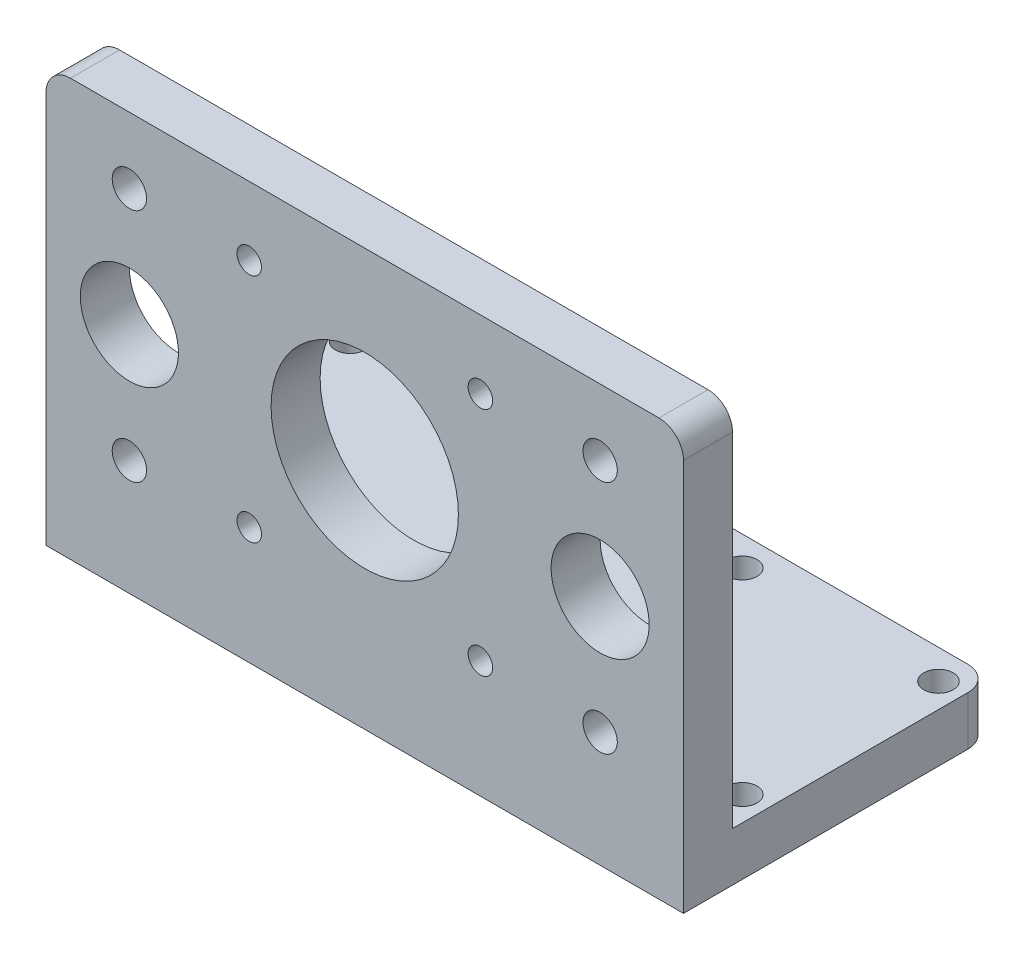
ISO-10303-21;
HEADER;
FILE_DESCRIPTION(('STEP AP214'),'2;1');
FILE_NAME('part.step','',(''),(''),'','','');
FILE_SCHEMA(('AUTOMOTIVE_DESIGN { 1 0 10303 214 1 1 1 1 }'));
ENDSEC;
DATA;
#1=APPLICATION_CONTEXT('core data for automotive mechanical design processes');
#2=APPLICATION_PROTOCOL_DEFINITION('international standard','automotive_design',2000,#1);
#3=PRODUCT_CONTEXT('',#1,'mechanical');
#4=PRODUCT('Part','Part','',(#3));
#5=PRODUCT_RELATED_PRODUCT_CATEGORY('part','',(#4));
#6=PRODUCT_DEFINITION_FORMATION('','',#4);
#7=PRODUCT_DEFINITION_CONTEXT('part definition',#1,'design');
#8=PRODUCT_DEFINITION('design','',#6,#7);
#9=PRODUCT_DEFINITION_SHAPE('','',#8);
#10=(LENGTH_UNIT() NAMED_UNIT(*) SI_UNIT(.MILLI.,.METRE.));
#11=(NAMED_UNIT(*) PLANE_ANGLE_UNIT() SI_UNIT($,.RADIAN.));
#12=(NAMED_UNIT(*) SI_UNIT($,.STERADIAN.) SOLID_ANGLE_UNIT());
#13=UNCERTAINTY_MEASURE_WITH_UNIT(LENGTH_MEASURE(1.E-05),#10,'distance_accuracy_value','');
#14=(GEOMETRIC_REPRESENTATION_CONTEXT(3) GLOBAL_UNCERTAINTY_ASSIGNED_CONTEXT((#13)) GLOBAL_UNIT_ASSIGNED_CONTEXT((#10,
#11,#12)) REPRESENTATION_CONTEXT('',''));
#15=CARTESIAN_POINT('',(0.,0.,0.));
#16=DIRECTION('',(0.,0.,1.));
#17=DIRECTION('',(1.,0.,0.));
#18=AXIS2_PLACEMENT_3D('',#15,#16,#17);
#19=CARTESIAN_POINT('',(0.,10.,0.));
#20=DIRECTION('',(-1.,0.,0.));
#21=DIRECTION('',(0.,0.,1.));
#22=AXIS2_PLACEMENT_3D('',#19,#20,#21);
#23=PLANE('',#22);
#24=DIRECTION('',(0.,-1.,0.));
#25=VECTOR('',#24,1.);
#26=CARTESIAN_POINT('',(0.,0.,0.));
#27=LINE('',#26,#25);
#28=CARTESIAN_POINT('',(0.,80.,0.));
#29=VERTEX_POINT('',#28);
#30=CARTESIAN_POINT('',(0.,0.,0.));
#31=VERTEX_POINT('',#30);
#32=EDGE_CURVE('E159',#29,#31,#27,.T.);
#33=ORIENTED_EDGE('',*,*,#32,.F.);
#34=DIRECTION('',(0.,0.,1.));
#35=VECTOR('',#34,1.);
#36=CARTESIAN_POINT('',(0.,80.,-10.));
#37=LINE('',#36,#35);
#38=CARTESIAN_POINT('',(0.,80.,-10.));
#39=VERTEX_POINT('',#38);
#40=EDGE_CURVE('E11',#29,#39,#37,.F.);
#41=ORIENTED_EDGE('',*,*,#40,.T.);
#42=DIRECTION('',(0.,-1.,0.));
#43=VECTOR('',#42,1.);
#44=CARTESIAN_POINT('',(0.,85.,-10.));
#45=LINE('',#44,#43);
#46=CARTESIAN_POINT('',(0.,10.,-10.));
#47=VERTEX_POINT('',#46);
#48=EDGE_CURVE('E115',#39,#47,#45,.T.);
#49=ORIENTED_EDGE('',*,*,#48,.T.);
#50=DIRECTION('',(0.,0.,-1.));
#51=VECTOR('',#50,1.);
#52=CARTESIAN_POINT('',(0.,10.,0.));
#53=LINE('',#52,#51);
#54=CARTESIAN_POINT('',(0.,10.,-58.));
#55=VERTEX_POINT('',#54);
#56=EDGE_CURVE('E118',#47,#55,#53,.T.);
#57=ORIENTED_EDGE('',*,*,#56,.T.);
#58=DIRECTION('',(0.,-1.,0.));
#59=VECTOR('',#58,1.);
#60=CARTESIAN_POINT('',(0.,10.,-58.));
#61=LINE('',#60,#59);
#62=CARTESIAN_POINT('',(0.,0.,-58.));
#63=VERTEX_POINT('',#62);
#64=EDGE_CURVE('E213',#55,#63,#61,.T.);
#65=ORIENTED_EDGE('',*,*,#64,.T.);
#66=DIRECTION('',(0.,0.,-1.));
#67=VECTOR('',#66,1.);
#68=CARTESIAN_POINT('',(0.,0.,0.));
#69=LINE('',#68,#67);
#70=EDGE_CURVE('E219',#31,#63,#69,.T.);
#71=ORIENTED_EDGE('',*,*,#70,.F.);
#72=EDGE_LOOP('',(#33,#41,#49,#57,#65,#71));
#73=FACE_BOUND('',#72,.T.);
#74=ADVANCED_FACE('F38',(#73),#23,.T.);
#75=CARTESIAN_POINT('',(130.,10.,0.));
#76=DIRECTION('',(-1.,0.,0.));
#77=DIRECTION('',(0.,0.,1.));
#78=AXIS2_PLACEMENT_3D('',#75,#76,#77);
#79=PLANE('',#78);
#80=DIRECTION('',(0.,-1.,0.));
#81=VECTOR('',#80,1.);
#82=CARTESIAN_POINT('',(130.,85.,-10.));
#83=LINE('',#82,#81);
#84=CARTESIAN_POINT('',(130.,80.,-10.));
#85=VERTEX_POINT('',#84);
#86=CARTESIAN_POINT('',(130.,10.,-10.));
#87=VERTEX_POINT('',#86);
#88=EDGE_CURVE('E124',#85,#87,#83,.T.);
#89=ORIENTED_EDGE('',*,*,#88,.F.);
#90=DIRECTION('',(0.,0.,-1.));
#91=VECTOR('',#90,1.);
#92=CARTESIAN_POINT('',(130.,80.,0.));
#93=LINE('',#92,#91);
#94=CARTESIAN_POINT('',(130.,80.,0.));
#95=VERTEX_POINT('',#94);
#96=EDGE_CURVE('E61',#85,#95,#93,.F.);
#97=ORIENTED_EDGE('',*,*,#96,.T.);
#98=DIRECTION('',(0.,1.,0.));
#99=VECTOR('',#98,1.);
#100=CARTESIAN_POINT('',(130.,0.,0.));
#101=LINE('',#100,#99);
#102=CARTESIAN_POINT('',(130.,0.,0.));
#103=VERTEX_POINT('',#102);
#104=EDGE_CURVE('E163',#103,#95,#101,.T.);
#105=ORIENTED_EDGE('',*,*,#104,.F.);
#106=DIRECTION('',(0.,0.,-1.));
#107=VECTOR('',#106,1.);
#108=CARTESIAN_POINT('',(130.,0.,0.));
#109=LINE('',#108,#107);
#110=CARTESIAN_POINT('',(130.,0.,-58.));
#111=VERTEX_POINT('',#110);
#112=EDGE_CURVE('E217',#103,#111,#109,.T.);
#113=ORIENTED_EDGE('',*,*,#112,.T.);
#114=DIRECTION('',(0.,-1.,0.));
#115=VECTOR('',#114,1.);
#116=CARTESIAN_POINT('',(130.,10.,-58.));
#117=LINE('',#116,#115);
#118=CARTESIAN_POINT('',(130.,10.,-58.));
#119=VERTEX_POINT('',#118);
#120=EDGE_CURVE('E210',#111,#119,#117,.F.);
#121=ORIENTED_EDGE('',*,*,#120,.T.);
#122=DIRECTION('',(0.,0.,-1.));
#123=VECTOR('',#122,1.);
#124=CARTESIAN_POINT('',(130.,10.,0.));
#125=LINE('',#124,#123);
#126=EDGE_CURVE('E137',#87,#119,#125,.T.);
#127=ORIENTED_EDGE('',*,*,#126,.F.);
#128=EDGE_LOOP('',(#89,#97,#105,#113,#121,#127));
#129=FACE_BOUND('',#128,.T.);
#130=ADVANCED_FACE('F264',(#129),#79,.F.);
#131=CARTESIAN_POINT('',(5.,10.,-57.));
#132=DIRECTION('',(0.,-1.,0.));
#133=DIRECTION('',(0.,0.,-1.));
#134=AXIS2_PLACEMENT_3D('',#131,#132,#133);
#135=CYLINDRICAL_SURFACE('',#134,3.);
#136=CARTESIAN_POINT('',(5.,10.,-57.));
#137=DIRECTION('',(0.,1.,0.));
#138=DIRECTION('',(0.,0.,1.));
#139=AXIS2_PLACEMENT_3D('',#136,#137,#138);
#140=CIRCLE('',#139,3.);
#141=CARTESIAN_POINT('',(5.,10.,-54.));
#142=VERTEX_POINT('',#141);
#143=EDGE_CURVE('E138',#142,#142,#140,.T.);
#144=ORIENTED_EDGE('',*,*,#143,.T.);
#145=EDGE_LOOP('',(#144));
#146=FACE_BOUND('',#145,.T.);
#147=CARTESIAN_POINT('',(5.,0.,-57.));
#148=DIRECTION('',(0.,1.,0.));
#149=DIRECTION('',(0.,0.,1.));
#150=AXIS2_PLACEMENT_3D('',#147,#148,#149);
#151=CIRCLE('',#150,3.);
#152=CARTESIAN_POINT('',(5.,0.,-54.));
#153=VERTEX_POINT('',#152);
#154=EDGE_CURVE('E221',#153,#153,#151,.T.);
#155=ORIENTED_EDGE('',*,*,#154,.F.);
#156=EDGE_LOOP('',(#155));
#157=FACE_BOUND('',#156,.T.);
#158=ADVANCED_FACE('F269',(#146,#157),#135,.F.);
#159=CARTESIAN_POINT('',(45.,10.,-57.));
#160=DIRECTION('',(0.,-1.,0.));
#161=DIRECTION('',(0.,0.,-1.));
#162=AXIS2_PLACEMENT_3D('',#159,#160,#161);
#163=CYLINDRICAL_SURFACE('',#162,3.);
#164=CARTESIAN_POINT('',(45.,10.,-57.));
#165=DIRECTION('',(0.,1.,0.));
#166=DIRECTION('',(0.,0.,1.));
#167=AXIS2_PLACEMENT_3D('',#164,#165,#166);
#168=CIRCLE('',#167,3.);
#169=CARTESIAN_POINT('',(45.,10.,-54.));
#170=VERTEX_POINT('',#169);
#171=EDGE_CURVE('E185',#170,#170,#168,.T.);
#172=ORIENTED_EDGE('',*,*,#171,.T.);
#173=EDGE_LOOP('',(#172));
#174=FACE_BOUND('',#173,.T.);
#175=CARTESIAN_POINT('',(45.,0.,-57.));
#176=DIRECTION('',(0.,1.,0.));
#177=DIRECTION('',(0.,0.,1.));
#178=AXIS2_PLACEMENT_3D('',#175,#176,#177);
#179=CIRCLE('',#178,3.);
#180=CARTESIAN_POINT('',(45.,0.,-54.));
#181=VERTEX_POINT('',#180);
#182=EDGE_CURVE('E224',#181,#181,#179,.T.);
#183=ORIENTED_EDGE('',*,*,#182,.F.);
#184=EDGE_LOOP('',(#183));
#185=FACE_BOUND('',#184,.T.);
#186=ADVANCED_FACE('F274',(#174,#185),#163,.F.);
#187=CARTESIAN_POINT('',(5.,10.,-17.));
#188=DIRECTION('',(0.,-1.,0.));
#189=DIRECTION('',(0.,0.,-1.));
#190=AXIS2_PLACEMENT_3D('',#187,#188,#189);
#191=CYLINDRICAL_SURFACE('',#190,3.);
#192=CARTESIAN_POINT('',(5.,10.,-17.));
#193=DIRECTION('',(0.,1.,0.));
#194=DIRECTION('',(0.,0.,1.));
#195=AXIS2_PLACEMENT_3D('',#192,#193,#194);
#196=CIRCLE('',#195,3.);
#197=CARTESIAN_POINT('',(5.,10.,-14.));
#198=VERTEX_POINT('',#197);
#199=EDGE_CURVE('E182',#198,#198,#196,.T.);
#200=ORIENTED_EDGE('',*,*,#199,.T.);
#201=EDGE_LOOP('',(#200));
#202=FACE_BOUND('',#201,.T.);
#203=CARTESIAN_POINT('',(5.,0.,-17.));
#204=DIRECTION('',(0.,1.,0.));
#205=DIRECTION('',(0.,0.,1.));
#206=AXIS2_PLACEMENT_3D('',#203,#204,#205);
#207=CIRCLE('',#206,3.);
#208=CARTESIAN_POINT('',(5.,0.,-14.));
#209=VERTEX_POINT('',#208);
#210=EDGE_CURVE('E227',#209,#209,#207,.T.);
#211=ORIENTED_EDGE('',*,*,#210,.F.);
#212=EDGE_LOOP('',(#211));
#213=FACE_BOUND('',#212,.T.);
#214=ADVANCED_FACE('F278',(#202,#213),#191,.F.);
#215=CARTESIAN_POINT('',(45.,10.,-17.));
#216=DIRECTION('',(0.,-1.,0.));
#217=DIRECTION('',(0.,0.,-1.));
#218=AXIS2_PLACEMENT_3D('',#215,#216,#217);
#219=CYLINDRICAL_SURFACE('',#218,3.);
#220=CARTESIAN_POINT('',(45.,10.,-17.));
#221=DIRECTION('',(0.,1.,0.));
#222=DIRECTION('',(0.,0.,1.));
#223=AXIS2_PLACEMENT_3D('',#220,#221,#222);
#224=CIRCLE('',#223,3.);
#225=CARTESIAN_POINT('',(45.,10.,-14.));
#226=VERTEX_POINT('',#225);
#227=EDGE_CURVE('E179',#226,#226,#224,.T.);
#228=ORIENTED_EDGE('',*,*,#227,.T.);
#229=EDGE_LOOP('',(#228));
#230=FACE_BOUND('',#229,.T.);
#231=CARTESIAN_POINT('',(45.,0.,-17.));
#232=DIRECTION('',(0.,1.,0.));
#233=DIRECTION('',(0.,0.,1.));
#234=AXIS2_PLACEMENT_3D('',#231,#232,#233);
#235=CIRCLE('',#234,3.);
#236=CARTESIAN_POINT('',(45.,0.,-14.));
#237=VERTEX_POINT('',#236);
#238=EDGE_CURVE('E230',#237,#237,#235,.T.);
#239=ORIENTED_EDGE('',*,*,#238,.F.);
#240=EDGE_LOOP('',(#239));
#241=FACE_BOUND('',#240,.T.);
#242=ADVANCED_FACE('F282',(#230,#241),#219,.F.);
#243=CARTESIAN_POINT('',(85.,10.,-57.));
#244=DIRECTION('',(0.,-1.,0.));
#245=DIRECTION('',(0.,0.,-1.));
#246=AXIS2_PLACEMENT_3D('',#243,#244,#245);
#247=CYLINDRICAL_SURFACE('',#246,3.00000000000001);
#248=CARTESIAN_POINT('',(85.,10.,-57.));
#249=DIRECTION('',(0.,1.,0.));
#250=DIRECTION('',(0.,0.,1.));
#251=AXIS2_PLACEMENT_3D('',#248,#249,#250);
#252=CIRCLE('',#251,3.00000000000001);
#253=CARTESIAN_POINT('',(85.,10.,-54.));
#254=VERTEX_POINT('',#253);
#255=EDGE_CURVE('E176',#254,#254,#252,.T.);
#256=ORIENTED_EDGE('',*,*,#255,.T.);
#257=EDGE_LOOP('',(#256));
#258=FACE_BOUND('',#257,.T.);
#259=CARTESIAN_POINT('',(85.,0.,-57.));
#260=DIRECTION('',(0.,1.,0.));
#261=DIRECTION('',(0.,0.,1.));
#262=AXIS2_PLACEMENT_3D('',#259,#260,#261);
#263=CIRCLE('',#262,3.00000000000001);
#264=CARTESIAN_POINT('',(85.,0.,-54.));
#265=VERTEX_POINT('',#264);
#266=EDGE_CURVE('E233',#265,#265,#263,.T.);
#267=ORIENTED_EDGE('',*,*,#266,.F.);
#268=EDGE_LOOP('',(#267));
#269=FACE_BOUND('',#268,.T.);
#270=ADVANCED_FACE('F286',(#258,#269),#247,.F.);
#271=CARTESIAN_POINT('',(125.,10.,-57.));
#272=DIRECTION('',(0.,-1.,0.));
#273=DIRECTION('',(0.,0.,-1.));
#274=AXIS2_PLACEMENT_3D('',#271,#272,#273);
#275=CYLINDRICAL_SURFACE('',#274,2.99999999999999);
#276=CARTESIAN_POINT('',(125.,10.,-57.));
#277=DIRECTION('',(0.,1.,0.));
#278=DIRECTION('',(0.,0.,1.));
#279=AXIS2_PLACEMENT_3D('',#276,#277,#278);
#280=CIRCLE('',#279,2.99999999999999);
#281=CARTESIAN_POINT('',(125.,10.,-54.));
#282=VERTEX_POINT('',#281);
#283=EDGE_CURVE('E173',#282,#282,#280,.T.);
#284=ORIENTED_EDGE('',*,*,#283,.T.);
#285=EDGE_LOOP('',(#284));
#286=FACE_BOUND('',#285,.T.);
#287=CARTESIAN_POINT('',(125.,0.,-57.));
#288=DIRECTION('',(0.,1.,0.));
#289=DIRECTION('',(0.,0.,1.));
#290=AXIS2_PLACEMENT_3D('',#287,#288,#289);
#291=CIRCLE('',#290,2.99999999999999);
#292=CARTESIAN_POINT('',(125.,0.,-54.));
#293=VERTEX_POINT('',#292);
#294=EDGE_CURVE('E236',#293,#293,#291,.T.);
#295=ORIENTED_EDGE('',*,*,#294,.F.);
#296=EDGE_LOOP('',(#295));
#297=FACE_BOUND('',#296,.T.);
#298=ADVANCED_FACE('F259',(#286,#297),#275,.F.);
#299=CARTESIAN_POINT('',(85.,10.,-17.));
#300=DIRECTION('',(0.,-1.,0.));
#301=DIRECTION('',(0.,0.,-1.));
#302=AXIS2_PLACEMENT_3D('',#299,#300,#301);
#303=CYLINDRICAL_SURFACE('',#302,3.00000000000001);
#304=CARTESIAN_POINT('',(85.,10.,-17.));
#305=DIRECTION('',(0.,1.,0.));
#306=DIRECTION('',(0.,0.,1.));
#307=AXIS2_PLACEMENT_3D('',#304,#305,#306);
#308=CIRCLE('',#307,3.00000000000001);
#309=CARTESIAN_POINT('',(85.,10.,-14.));
#310=VERTEX_POINT('',#309);
#311=EDGE_CURVE('E169',#310,#310,#308,.T.);
#312=ORIENTED_EDGE('',*,*,#311,.T.);
#313=EDGE_LOOP('',(#312));
#314=FACE_BOUND('',#313,.T.);
#315=CARTESIAN_POINT('',(85.,0.,-17.));
#316=DIRECTION('',(0.,1.,0.));
#317=DIRECTION('',(0.,0.,1.));
#318=AXIS2_PLACEMENT_3D('',#315,#316,#317);
#319=CIRCLE('',#318,3.00000000000001);
#320=CARTESIAN_POINT('',(85.,0.,-14.));
#321=VERTEX_POINT('',#320);
#322=EDGE_CURVE('E239',#321,#321,#319,.T.);
#323=ORIENTED_EDGE('',*,*,#322,.F.);
#324=EDGE_LOOP('',(#323));
#325=FACE_BOUND('',#324,.T.);
#326=ADVANCED_FACE('F250',(#314,#325),#303,.F.);
#327=CARTESIAN_POINT('',(125.,10.,-17.));
#328=DIRECTION('',(0.,-1.,0.));
#329=DIRECTION('',(0.,0.,-1.));
#330=AXIS2_PLACEMENT_3D('',#327,#328,#329);
#331=CYLINDRICAL_SURFACE('',#330,2.99999999999999);
#332=CARTESIAN_POINT('',(125.,10.,-17.));
#333=DIRECTION('',(0.,1.,0.));
#334=DIRECTION('',(0.,0.,1.));
#335=AXIS2_PLACEMENT_3D('',#332,#333,#334);
#336=CIRCLE('',#335,2.99999999999999);
#337=CARTESIAN_POINT('',(125.,10.,-14.));
#338=VERTEX_POINT('',#337);
#339=EDGE_CURVE('E166',#338,#338,#336,.T.);
#340=ORIENTED_EDGE('',*,*,#339,.T.);
#341=EDGE_LOOP('',(#340));
#342=FACE_BOUND('',#341,.T.);
#343=CARTESIAN_POINT('',(125.,0.,-17.));
#344=DIRECTION('',(0.,1.,0.));
#345=DIRECTION('',(0.,0.,1.));
#346=AXIS2_PLACEMENT_3D('',#343,#344,#345);
#347=CIRCLE('',#346,2.99999999999999);
#348=CARTESIAN_POINT('',(125.,0.,-14.));
#349=VERTEX_POINT('',#348);
#350=EDGE_CURVE('E165',#349,#349,#347,.T.);
#351=ORIENTED_EDGE('',*,*,#350,.F.);
#352=EDGE_LOOP('',(#351));
#353=FACE_BOUND('',#352,.T.);
#354=ADVANCED_FACE('F247',(#342,#353),#331,.F.);
#355=CARTESIAN_POINT('',(0.,10.,-63.));
#356=DIRECTION('',(0.,0.,-1.));
#357=DIRECTION('',(-1.,0.,0.));
#358=AXIS2_PLACEMENT_3D('',#355,#356,#357);
#359=PLANE('',#358);
#360=DIRECTION('',(1.,0.,0.));
#361=VECTOR('',#360,1.);
#362=CARTESIAN_POINT('',(0.,10.,-63.));
#363=LINE('',#362,#361);
#364=CARTESIAN_POINT('',(5.,10.,-63.));
#365=VERTEX_POINT('',#364);
#366=CARTESIAN_POINT('',(125.,10.,-63.));
#367=VERTEX_POINT('',#366);
#368=EDGE_CURVE('E193',#365,#367,#363,.T.);
#369=ORIENTED_EDGE('',*,*,#368,.T.);
#370=DIRECTION('',(0.,-1.,0.));
#371=VECTOR('',#370,1.);
#372=CARTESIAN_POINT('',(125.,0.,-63.));
#373=LINE('',#372,#371);
#374=CARTESIAN_POINT('',(125.,0.,-63.));
#375=VERTEX_POINT('',#374);
#376=EDGE_CURVE('E205',#367,#375,#373,.T.);
#377=ORIENTED_EDGE('',*,*,#376,.T.);
#378=DIRECTION('',(1.,0.,0.));
#379=VECTOR('',#378,1.);
#380=CARTESIAN_POINT('',(0.,0.,-63.));
#381=LINE('',#380,#379);
#382=CARTESIAN_POINT('',(5.,0.,-63.));
#383=VERTEX_POINT('',#382);
#384=EDGE_CURVE('E170',#383,#375,#381,.T.);
#385=ORIENTED_EDGE('',*,*,#384,.F.);
#386=DIRECTION('',(0.,-1.,0.));
#387=VECTOR('',#386,1.);
#388=CARTESIAN_POINT('',(5.,10.,-63.));
#389=LINE('',#388,#387);
#390=EDGE_CURVE('E208',#383,#365,#389,.F.);
#391=ORIENTED_EDGE('',*,*,#390,.T.);
#392=EDGE_LOOP('',(#369,#377,#385,#391));
#393=FACE_BOUND('',#392,.T.);
#394=ADVANCED_FACE('F249',(#393),#359,.T.);
#395=CARTESIAN_POINT('',(0.,10.,0.));
#396=DIRECTION('',(0.,1.,0.));
#397=DIRECTION('',(0.,0.,1.));
#398=AXIS2_PLACEMENT_3D('',#395,#396,#397);
#399=PLANE('',#398);
#400=DIRECTION('',(-1.,0.,0.));
#401=VECTOR('',#400,1.);
#402=CARTESIAN_POINT('',(0.,10.,-10.));
#403=LINE('',#402,#401);
#404=EDGE_CURVE('E131',#87,#47,#403,.T.);
#405=ORIENTED_EDGE('',*,*,#404,.F.);
#406=ORIENTED_EDGE('',*,*,#126,.T.);
#407=CARTESIAN_POINT('',(125.,10.,-58.));
#408=DIRECTION('',(0.,1.,0.));
#409=DIRECTION('',(0.,0.,1.));
#410=AXIS2_PLACEMENT_3D('',#407,#408,#409);
#411=CIRCLE('',#410,5.);
#412=EDGE_CURVE('E196',#119,#367,#411,.T.);
#413=ORIENTED_EDGE('',*,*,#412,.T.);
#414=ORIENTED_EDGE('',*,*,#368,.F.);
#415=CARTESIAN_POINT('',(5.,10.,-58.));
#416=DIRECTION('',(0.,1.,0.));
#417=DIRECTION('',(0.,0.,1.));
#418=AXIS2_PLACEMENT_3D('',#415,#416,#417);
#419=CIRCLE('',#418,5.);
#420=EDGE_CURVE('E135',#365,#55,#419,.T.);
#421=ORIENTED_EDGE('',*,*,#420,.T.);
#422=ORIENTED_EDGE('',*,*,#56,.F.);
#423=EDGE_LOOP('',(#405,#406,#413,#414,#421,#422));
#424=FACE_BOUND('',#423,.T.);
#425=ORIENTED_EDGE('',*,*,#339,.F.);
#426=EDGE_LOOP('',(#425));
#427=FACE_BOUND('',#426,.T.);
#428=ORIENTED_EDGE('',*,*,#311,.F.);
#429=EDGE_LOOP('',(#428));
#430=FACE_BOUND('',#429,.T.);
#431=ORIENTED_EDGE('',*,*,#283,.F.);
#432=EDGE_LOOP('',(#431));
#433=FACE_BOUND('',#432,.T.);
#434=ORIENTED_EDGE('',*,*,#255,.F.);
#435=EDGE_LOOP('',(#434));
#436=FACE_BOUND('',#435,.T.);
#437=ORIENTED_EDGE('',*,*,#227,.F.);
#438=EDGE_LOOP('',(#437));
#439=FACE_BOUND('',#438,.T.);
#440=ORIENTED_EDGE('',*,*,#199,.F.);
#441=EDGE_LOOP('',(#440));
#442=FACE_BOUND('',#441,.T.);
#443=ORIENTED_EDGE('',*,*,#171,.F.);
#444=EDGE_LOOP('',(#443));
#445=FACE_BOUND('',#444,.T.);
#446=ORIENTED_EDGE('',*,*,#143,.F.);
#447=EDGE_LOOP('',(#446));
#448=FACE_BOUND('',#447,.T.);
#449=ADVANCED_FACE('F129',(#424,#427,#430,#433,#436,#439,#442,#445,#448),#399,.T.);
#450=CARTESIAN_POINT('',(0.,0.,0.));
#451=DIRECTION('',(0.,1.,0.));
#452=DIRECTION('',(0.,0.,1.));
#453=AXIS2_PLACEMENT_3D('',#450,#451,#452);
#454=PLANE('',#453);
#455=ORIENTED_EDGE('',*,*,#350,.T.);
#456=EDGE_LOOP('',(#455));
#457=FACE_BOUND('',#456,.T.);
#458=ORIENTED_EDGE('',*,*,#322,.T.);
#459=EDGE_LOOP('',(#458));
#460=FACE_BOUND('',#459,.T.);
#461=ORIENTED_EDGE('',*,*,#294,.T.);
#462=EDGE_LOOP('',(#461));
#463=FACE_BOUND('',#462,.T.);
#464=ORIENTED_EDGE('',*,*,#266,.T.);
#465=EDGE_LOOP('',(#464));
#466=FACE_BOUND('',#465,.T.);
#467=ORIENTED_EDGE('',*,*,#238,.T.);
#468=EDGE_LOOP('',(#467));
#469=FACE_BOUND('',#468,.T.);
#470=ORIENTED_EDGE('',*,*,#210,.T.);
#471=EDGE_LOOP('',(#470));
#472=FACE_BOUND('',#471,.T.);
#473=ORIENTED_EDGE('',*,*,#182,.T.);
#474=EDGE_LOOP('',(#473));
#475=FACE_BOUND('',#474,.T.);
#476=ORIENTED_EDGE('',*,*,#154,.T.);
#477=EDGE_LOOP('',(#476));
#478=FACE_BOUND('',#477,.T.);
#479=ORIENTED_EDGE('',*,*,#112,.F.);
#480=DIRECTION('',(1.,0.,0.));
#481=VECTOR('',#480,1.);
#482=CARTESIAN_POINT('',(0.,0.,0.));
#483=LINE('',#482,#481);
#484=EDGE_CURVE('E161',#31,#103,#483,.T.);
#485=ORIENTED_EDGE('',*,*,#484,.F.);
#486=ORIENTED_EDGE('',*,*,#70,.T.);
#487=CARTESIAN_POINT('',(5.,0.,-58.));
#488=DIRECTION('',(0.,1.,0.));
#489=DIRECTION('',(0.,0.,1.));
#490=AXIS2_PLACEMENT_3D('',#487,#488,#489);
#491=CIRCLE('',#490,5.);
#492=EDGE_CURVE('E203',#63,#383,#491,.F.);
#493=ORIENTED_EDGE('',*,*,#492,.T.);
#494=ORIENTED_EDGE('',*,*,#384,.T.);
#495=CARTESIAN_POINT('',(125.,0.,-58.));
#496=DIRECTION('',(0.,1.,0.));
#497=DIRECTION('',(0.,0.,1.));
#498=AXIS2_PLACEMENT_3D('',#495,#496,#497);
#499=CIRCLE('',#498,5.);
#500=EDGE_CURVE('E200',#375,#111,#499,.F.);
#501=ORIENTED_EDGE('',*,*,#500,.T.);
#502=EDGE_LOOP('',(#479,#485,#486,#493,#494,#501));
#503=FACE_BOUND('',#502,.T.);
#504=ADVANCED_FACE('F244',(#457,#460,#463,#466,#469,#472,#475,#478,#503),#454,.F.);
#505=CARTESIAN_POINT('',(125.,10.,-58.));
#506=DIRECTION('',(0.,1.,0.));
#507=DIRECTION('',(0.,0.,1.));
#508=AXIS2_PLACEMENT_3D('',#505,#506,#507);
#509=CYLINDRICAL_SURFACE('',#508,5.);
#510=ORIENTED_EDGE('',*,*,#412,.F.);
#511=ORIENTED_EDGE('',*,*,#120,.F.);
#512=ORIENTED_EDGE('',*,*,#500,.F.);
#513=ORIENTED_EDGE('',*,*,#376,.F.);
#514=EDGE_LOOP('',(#510,#511,#512,#513));
#515=FACE_BOUND('',#514,.T.);
#516=ADVANCED_FACE('F301',(#515),#509,.T.);
#517=CARTESIAN_POINT('',(5.,10.,-58.));
#518=DIRECTION('',(0.,-1.,0.));
#519=DIRECTION('',(0.,0.,-1.));
#520=AXIS2_PLACEMENT_3D('',#517,#518,#519);
#521=CYLINDRICAL_SURFACE('',#520,5.);
#522=ORIENTED_EDGE('',*,*,#420,.F.);
#523=ORIENTED_EDGE('',*,*,#390,.F.);
#524=ORIENTED_EDGE('',*,*,#492,.F.);
#525=ORIENTED_EDGE('',*,*,#64,.F.);
#526=EDGE_LOOP('',(#522,#523,#524,#525));
#527=FACE_BOUND('',#526,.T.);
#528=ADVANCED_FACE('F355',(#527),#521,.T.);
#529=CARTESIAN_POINT('',(0.,0.,0.));
#530=DIRECTION('',(0.,0.,-1.));
#531=DIRECTION('',(-1.,0.,0.));
#532=AXIS2_PLACEMENT_3D('',#529,#530,#531);
#533=PLANE('',#532);
#534=CARTESIAN_POINT('',(65.,47.5,0.));
#535=DIRECTION('',(0.,0.,-1.));
#536=DIRECTION('',(-1.,0.,0.));
#537=AXIS2_PLACEMENT_3D('',#534,#535,#536);
#538=CIRCLE('',#537,19.1);
#539=CARTESIAN_POINT('',(45.9,47.5,0.));
#540=VERTEX_POINT('',#539);
#541=EDGE_CURVE('E645',#540,#540,#538,.T.);
#542=ORIENTED_EDGE('',*,*,#541,.T.);
#543=EDGE_LOOP('',(#542));
#544=FACE_BOUND('',#543,.T.);
#545=CARTESIAN_POINT('',(88.58,23.92,0.));
#546=DIRECTION('',(0.,0.,-1.));
#547=DIRECTION('',(-1.,0.,0.));
#548=AXIS2_PLACEMENT_3D('',#545,#546,#547);
#549=CIRCLE('',#548,2.5);
#550=CARTESIAN_POINT('',(86.08,23.92,0.));
#551=VERTEX_POINT('',#550);
#552=EDGE_CURVE('E653',#551,#551,#549,.T.);
#553=ORIENTED_EDGE('',*,*,#552,.T.);
#554=EDGE_LOOP('',(#553));
#555=FACE_BOUND('',#554,.T.);
#556=CARTESIAN_POINT('',(41.44,23.92,0.));
#557=DIRECTION('',(0.,0.,-1.));
#558=DIRECTION('',(-1.,0.,0.));
#559=AXIS2_PLACEMENT_3D('',#556,#557,#558);
#560=CIRCLE('',#559,2.5);
#561=CARTESIAN_POINT('',(38.94,23.92,0.));
#562=VERTEX_POINT('',#561);
#563=EDGE_CURVE('E659',#562,#562,#560,.T.);
#564=ORIENTED_EDGE('',*,*,#563,.T.);
#565=EDGE_LOOP('',(#564));
#566=FACE_BOUND('',#565,.T.);
#567=CARTESIAN_POINT('',(41.44,71.06,0.));
#568=DIRECTION('',(0.,0.,-1.));
#569=DIRECTION('',(-1.,0.,0.));
#570=AXIS2_PLACEMENT_3D('',#567,#568,#569);
#571=CIRCLE('',#570,2.5);
#572=CARTESIAN_POINT('',(38.94,71.06,0.));
#573=VERTEX_POINT('',#572);
#574=EDGE_CURVE('E665',#573,#573,#571,.T.);
#575=ORIENTED_EDGE('',*,*,#574,.T.);
#576=EDGE_LOOP('',(#575));
#577=FACE_BOUND('',#576,.T.);
#578=CARTESIAN_POINT('',(88.58,71.06,0.));
#579=DIRECTION('',(0.,0.,-1.));
#580=DIRECTION('',(-1.,0.,0.));
#581=AXIS2_PLACEMENT_3D('',#578,#579,#580);
#582=CIRCLE('',#581,2.5);
#583=CARTESIAN_POINT('',(86.08,71.06,0.));
#584=VERTEX_POINT('',#583);
#585=EDGE_CURVE('E671',#584,#584,#582,.T.);
#586=ORIENTED_EDGE('',*,*,#585,.T.);
#587=EDGE_LOOP('',(#586));
#588=FACE_BOUND('',#587,.T.);
#589=CARTESIAN_POINT('',(113.,23.5,0.));
#590=DIRECTION('',(0.,0.,-1.));
#591=DIRECTION('',(-1.,0.,0.));
#592=AXIS2_PLACEMENT_3D('',#589,#590,#591);
#593=CIRCLE('',#592,3.50000000000001);
#594=CARTESIAN_POINT('',(109.5,23.5,0.));
#595=VERTEX_POINT('',#594);
#596=EDGE_CURVE('E677',#595,#595,#593,.T.);
#597=ORIENTED_EDGE('',*,*,#596,.T.);
#598=EDGE_LOOP('',(#597));
#599=FACE_BOUND('',#598,.T.);
#600=CARTESIAN_POINT('',(17.,23.5,0.));
#601=DIRECTION('',(0.,0.,-1.));
#602=DIRECTION('',(-1.,0.,0.));
#603=AXIS2_PLACEMENT_3D('',#600,#601,#602);
#604=CIRCLE('',#603,3.5);
#605=CARTESIAN_POINT('',(13.5,23.5,0.));
#606=VERTEX_POINT('',#605);
#607=EDGE_CURVE('E683',#606,#606,#604,.T.);
#608=ORIENTED_EDGE('',*,*,#607,.T.);
#609=EDGE_LOOP('',(#608));
#610=FACE_BOUND('',#609,.T.);
#611=CARTESIAN_POINT('',(17.,71.5,0.));
#612=DIRECTION('',(0.,0.,-1.));
#613=DIRECTION('',(-1.,0.,0.));
#614=AXIS2_PLACEMENT_3D('',#611,#612,#613);
#615=CIRCLE('',#614,3.5);
#616=CARTESIAN_POINT('',(13.5,71.5,0.));
#617=VERTEX_POINT('',#616);
#618=EDGE_CURVE('E689',#617,#617,#615,.T.);
#619=ORIENTED_EDGE('',*,*,#618,.T.);
#620=EDGE_LOOP('',(#619));
#621=FACE_BOUND('',#620,.T.);
#622=CARTESIAN_POINT('',(113.,71.5,0.));
#623=DIRECTION('',(0.,0.,-1.));
#624=DIRECTION('',(-1.,0.,0.));
#625=AXIS2_PLACEMENT_3D('',#622,#623,#624);
#626=CIRCLE('',#625,3.50000000000001);
#627=CARTESIAN_POINT('',(109.5,71.5,0.));
#628=VERTEX_POINT('',#627);
#629=EDGE_CURVE('E695',#628,#628,#626,.T.);
#630=ORIENTED_EDGE('',*,*,#629,.T.);
#631=EDGE_LOOP('',(#630));
#632=FACE_BOUND('',#631,.T.);
#633=CARTESIAN_POINT('',(17.,47.5,0.));
#634=DIRECTION('',(0.,0.,-1.));
#635=DIRECTION('',(-1.,0.,0.));
#636=AXIS2_PLACEMENT_3D('',#633,#634,#635);
#637=CIRCLE('',#636,10.);
#638=CARTESIAN_POINT('',(7.,47.5,0.));
#639=VERTEX_POINT('',#638);
#640=EDGE_CURVE('E701',#639,#639,#637,.T.);
#641=ORIENTED_EDGE('',*,*,#640,.T.);
#642=EDGE_LOOP('',(#641));
#643=FACE_BOUND('',#642,.T.);
#644=CARTESIAN_POINT('',(113.,47.5,0.));
#645=DIRECTION('',(0.,0.,-1.));
#646=DIRECTION('',(-1.,0.,0.));
#647=AXIS2_PLACEMENT_3D('',#644,#645,#646);
#648=CIRCLE('',#647,9.99999999999999);
#649=CARTESIAN_POINT('',(103.,47.5,0.));
#650=VERTEX_POINT('',#649);
#651=EDGE_CURVE('E143',#650,#650,#648,.T.);
#652=ORIENTED_EDGE('',*,*,#651,.T.);
#653=EDGE_LOOP('',(#652));
#654=FACE_BOUND('',#653,.T.);
#655=ORIENTED_EDGE('',*,*,#104,.T.);
#656=CARTESIAN_POINT('',(125.,80.,0.));
#657=DIRECTION('',(0.,0.,-1.));
#658=DIRECTION('',(-1.,0.,0.));
#659=AXIS2_PLACEMENT_3D('',#656,#657,#658);
#660=CIRCLE('',#659,5.);
#661=CARTESIAN_POINT('',(125.,85.,0.));
#662=VERTEX_POINT('',#661);
#663=EDGE_CURVE('E46',#95,#662,#660,.F.);
#664=ORIENTED_EDGE('',*,*,#663,.T.);
#665=DIRECTION('',(1.,0.,0.));
#666=VECTOR('',#665,1.);
#667=CARTESIAN_POINT('',(0.,85.,0.));
#668=LINE('',#667,#666);
#669=CARTESIAN_POINT('',(5.,85.,0.));
#670=VERTEX_POINT('',#669);
#671=EDGE_CURVE('E142',#670,#662,#668,.T.);
#672=ORIENTED_EDGE('',*,*,#671,.F.);
#673=CARTESIAN_POINT('',(5.,80.,0.));
#674=DIRECTION('',(0.,0.,-1.));
#675=DIRECTION('',(-1.,0.,0.));
#676=AXIS2_PLACEMENT_3D('',#673,#674,#675);
#677=CIRCLE('',#676,5.);
#678=EDGE_CURVE('E53',#670,#29,#677,.F.);
#679=ORIENTED_EDGE('',*,*,#678,.T.);
#680=ORIENTED_EDGE('',*,*,#32,.T.);
#681=ORIENTED_EDGE('',*,*,#484,.T.);
#682=EDGE_LOOP('',(#655,#664,#672,#679,#680,#681));
#683=FACE_BOUND('',#682,.T.);
#684=ADVANCED_FACE('F319',(#544,#555,#566,#577,#588,#599,#610,#621,#632,#643,#654,#683),#533,.F.);
#685=CARTESIAN_POINT('',(0.,85.,-10.));
#686=DIRECTION('',(0.,0.,1.));
#687=DIRECTION('',(1.,0.,0.));
#688=AXIS2_PLACEMENT_3D('',#685,#686,#687);
#689=PLANE('',#688);
#690=CARTESIAN_POINT('',(65.,47.5,-10.));
#691=DIRECTION('',(0.,0.,-1.));
#692=DIRECTION('',(-1.,0.,0.));
#693=AXIS2_PLACEMENT_3D('',#690,#691,#692);
#694=CIRCLE('',#693,19.1);
#695=CARTESIAN_POINT('',(45.9,47.5,-10.));
#696=VERTEX_POINT('',#695);
#697=EDGE_CURVE('E648',#696,#696,#694,.T.);
#698=ORIENTED_EDGE('',*,*,#697,.F.);
#699=EDGE_LOOP('',(#698));
#700=FACE_BOUND('',#699,.T.);
#701=CARTESIAN_POINT('',(88.58,23.92,-10.));
#702=DIRECTION('',(0.,0.,-1.));
#703=DIRECTION('',(-1.,0.,0.));
#704=AXIS2_PLACEMENT_3D('',#701,#702,#703);
#705=CIRCLE('',#704,2.5);
#706=CARTESIAN_POINT('',(86.08,23.92,-10.));
#707=VERTEX_POINT('',#706);
#708=EDGE_CURVE('E650',#707,#707,#705,.T.);
#709=ORIENTED_EDGE('',*,*,#708,.F.);
#710=EDGE_LOOP('',(#709));
#711=FACE_BOUND('',#710,.T.);
#712=CARTESIAN_POINT('',(41.44,23.92,-10.));
#713=DIRECTION('',(0.,0.,-1.));
#714=DIRECTION('',(-1.,0.,0.));
#715=AXIS2_PLACEMENT_3D('',#712,#713,#714);
#716=CIRCLE('',#715,2.5);
#717=CARTESIAN_POINT('',(38.94,23.92,-10.));
#718=VERTEX_POINT('',#717);
#719=EDGE_CURVE('E656',#718,#718,#716,.T.);
#720=ORIENTED_EDGE('',*,*,#719,.F.);
#721=EDGE_LOOP('',(#720));
#722=FACE_BOUND('',#721,.T.);
#723=CARTESIAN_POINT('',(41.44,71.06,-10.));
#724=DIRECTION('',(0.,0.,-1.));
#725=DIRECTION('',(-1.,0.,0.));
#726=AXIS2_PLACEMENT_3D('',#723,#724,#725);
#727=CIRCLE('',#726,2.5);
#728=CARTESIAN_POINT('',(38.94,71.06,-10.));
#729=VERTEX_POINT('',#728);
#730=EDGE_CURVE('E662',#729,#729,#727,.T.);
#731=ORIENTED_EDGE('',*,*,#730,.F.);
#732=EDGE_LOOP('',(#731));
#733=FACE_BOUND('',#732,.T.);
#734=CARTESIAN_POINT('',(88.58,71.06,-10.));
#735=DIRECTION('',(0.,0.,-1.));
#736=DIRECTION('',(-1.,0.,0.));
#737=AXIS2_PLACEMENT_3D('',#734,#735,#736);
#738=CIRCLE('',#737,2.5);
#739=CARTESIAN_POINT('',(86.08,71.06,-10.));
#740=VERTEX_POINT('',#739);
#741=EDGE_CURVE('E668',#740,#740,#738,.T.);
#742=ORIENTED_EDGE('',*,*,#741,.F.);
#743=EDGE_LOOP('',(#742));
#744=FACE_BOUND('',#743,.T.);
#745=CARTESIAN_POINT('',(113.,23.5,-10.));
#746=DIRECTION('',(0.,0.,-1.));
#747=DIRECTION('',(-1.,0.,0.));
#748=AXIS2_PLACEMENT_3D('',#745,#746,#747);
#749=CIRCLE('',#748,3.50000000000001);
#750=CARTESIAN_POINT('',(109.5,23.5,-10.));
#751=VERTEX_POINT('',#750);
#752=EDGE_CURVE('E674',#751,#751,#749,.T.);
#753=ORIENTED_EDGE('',*,*,#752,.F.);
#754=EDGE_LOOP('',(#753));
#755=FACE_BOUND('',#754,.T.);
#756=CARTESIAN_POINT('',(17.,23.5,-10.));
#757=DIRECTION('',(0.,0.,-1.));
#758=DIRECTION('',(-1.,0.,0.));
#759=AXIS2_PLACEMENT_3D('',#756,#757,#758);
#760=CIRCLE('',#759,3.5);
#761=CARTESIAN_POINT('',(13.5,23.5,-10.));
#762=VERTEX_POINT('',#761);
#763=EDGE_CURVE('E680',#762,#762,#760,.T.);
#764=ORIENTED_EDGE('',*,*,#763,.F.);
#765=EDGE_LOOP('',(#764));
#766=FACE_BOUND('',#765,.T.);
#767=CARTESIAN_POINT('',(17.,71.5,-10.));
#768=DIRECTION('',(0.,0.,-1.));
#769=DIRECTION('',(-1.,0.,0.));
#770=AXIS2_PLACEMENT_3D('',#767,#768,#769);
#771=CIRCLE('',#770,3.5);
#772=CARTESIAN_POINT('',(13.5,71.5,-10.));
#773=VERTEX_POINT('',#772);
#774=EDGE_CURVE('E686',#773,#773,#771,.T.);
#775=ORIENTED_EDGE('',*,*,#774,.F.);
#776=EDGE_LOOP('',(#775));
#777=FACE_BOUND('',#776,.T.);
#778=CARTESIAN_POINT('',(113.,71.5,-10.));
#779=DIRECTION('',(0.,0.,-1.));
#780=DIRECTION('',(-1.,0.,0.));
#781=AXIS2_PLACEMENT_3D('',#778,#779,#780);
#782=CIRCLE('',#781,3.50000000000001);
#783=CARTESIAN_POINT('',(109.5,71.5,-10.));
#784=VERTEX_POINT('',#783);
#785=EDGE_CURVE('E692',#784,#784,#782,.T.);
#786=ORIENTED_EDGE('',*,*,#785,.F.);
#787=EDGE_LOOP('',(#786));
#788=FACE_BOUND('',#787,.T.);
#789=CARTESIAN_POINT('',(17.,47.5,-10.));
#790=DIRECTION('',(0.,0.,-1.));
#791=DIRECTION('',(-1.,0.,0.));
#792=AXIS2_PLACEMENT_3D('',#789,#790,#791);
#793=CIRCLE('',#792,10.);
#794=CARTESIAN_POINT('',(7.,47.5,-10.));
#795=VERTEX_POINT('',#794);
#796=EDGE_CURVE('E698',#795,#795,#793,.T.);
#797=ORIENTED_EDGE('',*,*,#796,.F.);
#798=EDGE_LOOP('',(#797));
#799=FACE_BOUND('',#798,.T.);
#800=CARTESIAN_POINT('',(113.,47.5,-10.));
#801=DIRECTION('',(0.,0.,-1.));
#802=DIRECTION('',(-1.,0.,0.));
#803=AXIS2_PLACEMENT_3D('',#800,#801,#802);
#804=CIRCLE('',#803,9.99999999999999);
#805=CARTESIAN_POINT('',(103.,47.5,-10.));
#806=VERTEX_POINT('',#805);
#807=EDGE_CURVE('E148',#806,#806,#804,.T.);
#808=ORIENTED_EDGE('',*,*,#807,.F.);
#809=EDGE_LOOP('',(#808));
#810=FACE_BOUND('',#809,.T.);
#811=DIRECTION('',(-1.,0.,0.));
#812=VECTOR('',#811,1.);
#813=CARTESIAN_POINT('',(0.,85.,-10.));
#814=LINE('',#813,#812);
#815=CARTESIAN_POINT('',(125.,85.,-10.));
#816=VERTEX_POINT('',#815);
#817=CARTESIAN_POINT('',(5.,85.,-10.));
#818=VERTEX_POINT('',#817);
#819=EDGE_CURVE('E125',#816,#818,#814,.T.);
#820=ORIENTED_EDGE('',*,*,#819,.F.);
#821=CARTESIAN_POINT('',(125.,80.,-10.));
#822=DIRECTION('',(0.,0.,1.));
#823=DIRECTION('',(1.,0.,0.));
#824=AXIS2_PLACEMENT_3D('',#821,#822,#823);
#825=CIRCLE('',#824,5.);
#826=EDGE_CURVE('E328',#816,#85,#825,.F.);
#827=ORIENTED_EDGE('',*,*,#826,.T.);
#828=ORIENTED_EDGE('',*,*,#88,.T.);
#829=ORIENTED_EDGE('',*,*,#404,.T.);
#830=ORIENTED_EDGE('',*,*,#48,.F.);
#831=CARTESIAN_POINT('',(5.,80.,-10.));
#832=DIRECTION('',(0.,0.,1.));
#833=DIRECTION('',(1.,0.,0.));
#834=AXIS2_PLACEMENT_3D('',#831,#832,#833);
#835=CIRCLE('',#834,5.);
#836=EDGE_CURVE('E330',#39,#818,#835,.F.);
#837=ORIENTED_EDGE('',*,*,#836,.T.);
#838=EDGE_LOOP('',(#820,#827,#828,#829,#830,#837));
#839=FACE_BOUND('',#838,.T.);
#840=ADVANCED_FACE('F141',(#700,#711,#722,#733,#744,#755,#766,#777,#788,#799,#810,#839),#689,.F.);
#841=CARTESIAN_POINT('',(0.,85.,0.));
#842=DIRECTION('',(0.,-1.,0.));
#843=DIRECTION('',(0.,0.,-1.));
#844=AXIS2_PLACEMENT_3D('',#841,#842,#843);
#845=PLANE('',#844);
#846=ORIENTED_EDGE('',*,*,#671,.T.);
#847=DIRECTION('',(0.,0.,-1.));
#848=VECTOR('',#847,1.);
#849=CARTESIAN_POINT('',(125.,85.,0.));
#850=LINE('',#849,#848);
#851=EDGE_CURVE('E324',#662,#816,#850,.T.);
#852=ORIENTED_EDGE('',*,*,#851,.T.);
#853=ORIENTED_EDGE('',*,*,#819,.T.);
#854=DIRECTION('',(0.,0.,1.));
#855=VECTOR('',#854,1.);
#856=CARTESIAN_POINT('',(5.,85.,0.));
#857=LINE('',#856,#855);
#858=EDGE_CURVE('E198',#818,#670,#857,.T.);
#859=ORIENTED_EDGE('',*,*,#858,.T.);
#860=EDGE_LOOP('',(#846,#852,#853,#859));
#861=FACE_BOUND('',#860,.T.);
#862=ADVANCED_FACE('F338',(#861),#845,.F.);
#863=CARTESIAN_POINT('',(125.,80.,0.));
#864=DIRECTION('',(0.,0.,-1.));
#865=DIRECTION('',(-1.,0.,0.));
#866=AXIS2_PLACEMENT_3D('',#863,#864,#865);
#867=CYLINDRICAL_SURFACE('',#866,5.);
#868=ORIENTED_EDGE('',*,*,#663,.F.);
#869=ORIENTED_EDGE('',*,*,#96,.F.);
#870=ORIENTED_EDGE('',*,*,#826,.F.);
#871=ORIENTED_EDGE('',*,*,#851,.F.);
#872=EDGE_LOOP('',(#868,#869,#870,#871));
#873=FACE_BOUND('',#872,.T.);
#874=ADVANCED_FACE('F322',(#873),#867,.T.);
#875=CARTESIAN_POINT('',(5.,80.,0.));
#876=DIRECTION('',(0.,0.,-1.));
#877=DIRECTION('',(-1.,0.,0.));
#878=AXIS2_PLACEMENT_3D('',#875,#876,#877);
#879=CYLINDRICAL_SURFACE('',#878,5.);
#880=ORIENTED_EDGE('',*,*,#836,.F.);
#881=ORIENTED_EDGE('',*,*,#40,.F.);
#882=ORIENTED_EDGE('',*,*,#678,.F.);
#883=ORIENTED_EDGE('',*,*,#858,.F.);
#884=EDGE_LOOP('',(#880,#881,#882,#883));
#885=FACE_BOUND('',#884,.T.);
#886=ADVANCED_FACE('F40',(#885),#879,.T.);
#887=CARTESIAN_POINT('',(113.,47.5,0.));
#888=DIRECTION('',(0.,0.,-1.));
#889=DIRECTION('',(-1.,0.,0.));
#890=AXIS2_PLACEMENT_3D('',#887,#888,#889);
#891=CYLINDRICAL_SURFACE('',#890,9.99999999999999);
#892=ORIENTED_EDGE('',*,*,#651,.F.);
#893=EDGE_LOOP('',(#892));
#894=FACE_BOUND('',#893,.T.);
#895=ORIENTED_EDGE('',*,*,#807,.T.);
#896=EDGE_LOOP('',(#895));
#897=FACE_BOUND('',#896,.T.);
#898=ADVANCED_FACE('F342',(#894,#897),#891,.F.);
#899=CARTESIAN_POINT('',(17.,47.5,0.));
#900=DIRECTION('',(0.,0.,-1.));
#901=DIRECTION('',(-1.,0.,0.));
#902=AXIS2_PLACEMENT_3D('',#899,#900,#901);
#903=CYLINDRICAL_SURFACE('',#902,10.);
#904=ORIENTED_EDGE('',*,*,#640,.F.);
#905=EDGE_LOOP('',(#904));
#906=FACE_BOUND('',#905,.T.);
#907=ORIENTED_EDGE('',*,*,#796,.T.);
#908=EDGE_LOOP('',(#907));
#909=FACE_BOUND('',#908,.T.);
#910=ADVANCED_FACE('F347',(#906,#909),#903,.F.);
#911=CARTESIAN_POINT('',(113.,71.5,0.));
#912=DIRECTION('',(0.,0.,-1.));
#913=DIRECTION('',(-1.,0.,0.));
#914=AXIS2_PLACEMENT_3D('',#911,#912,#913);
#915=CYLINDRICAL_SURFACE('',#914,3.50000000000001);
#916=ORIENTED_EDGE('',*,*,#629,.F.);
#917=EDGE_LOOP('',(#916));
#918=FACE_BOUND('',#917,.T.);
#919=ORIENTED_EDGE('',*,*,#785,.T.);
#920=EDGE_LOOP('',(#919));
#921=FACE_BOUND('',#920,.T.);
#922=ADVANCED_FACE('F421',(#918,#921),#915,.F.);
#923=CARTESIAN_POINT('',(17.,71.5,0.));
#924=DIRECTION('',(0.,0.,-1.));
#925=DIRECTION('',(-1.,0.,0.));
#926=AXIS2_PLACEMENT_3D('',#923,#924,#925);
#927=CYLINDRICAL_SURFACE('',#926,3.5);
#928=ORIENTED_EDGE('',*,*,#618,.F.);
#929=EDGE_LOOP('',(#928));
#930=FACE_BOUND('',#929,.T.);
#931=ORIENTED_EDGE('',*,*,#774,.T.);
#932=EDGE_LOOP('',(#931));
#933=FACE_BOUND('',#932,.T.);
#934=ADVANCED_FACE('F431',(#930,#933),#927,.F.);
#935=CARTESIAN_POINT('',(17.,23.5,0.));
#936=DIRECTION('',(0.,0.,-1.));
#937=DIRECTION('',(-1.,0.,0.));
#938=AXIS2_PLACEMENT_3D('',#935,#936,#937);
#939=CYLINDRICAL_SURFACE('',#938,3.5);
#940=ORIENTED_EDGE('',*,*,#607,.F.);
#941=EDGE_LOOP('',(#940));
#942=FACE_BOUND('',#941,.T.);
#943=ORIENTED_EDGE('',*,*,#763,.T.);
#944=EDGE_LOOP('',(#943));
#945=FACE_BOUND('',#944,.T.);
#946=ADVANCED_FACE('F441',(#942,#945),#939,.F.);
#947=CARTESIAN_POINT('',(113.,23.5,0.));
#948=DIRECTION('',(0.,0.,-1.));
#949=DIRECTION('',(-1.,0.,0.));
#950=AXIS2_PLACEMENT_3D('',#947,#948,#949);
#951=CYLINDRICAL_SURFACE('',#950,3.50000000000001);
#952=ORIENTED_EDGE('',*,*,#596,.F.);
#953=EDGE_LOOP('',(#952));
#954=FACE_BOUND('',#953,.T.);
#955=ORIENTED_EDGE('',*,*,#752,.T.);
#956=EDGE_LOOP('',(#955));
#957=FACE_BOUND('',#956,.T.);
#958=ADVANCED_FACE('F451',(#954,#957),#951,.F.);
#959=CARTESIAN_POINT('',(88.58,71.06,0.));
#960=DIRECTION('',(0.,0.,-1.));
#961=DIRECTION('',(-1.,0.,0.));
#962=AXIS2_PLACEMENT_3D('',#959,#960,#961);
#963=CYLINDRICAL_SURFACE('',#962,2.5);
#964=ORIENTED_EDGE('',*,*,#585,.F.);
#965=EDGE_LOOP('',(#964));
#966=FACE_BOUND('',#965,.T.);
#967=ORIENTED_EDGE('',*,*,#741,.T.);
#968=EDGE_LOOP('',(#967));
#969=FACE_BOUND('',#968,.T.);
#970=ADVANCED_FACE('F461',(#966,#969),#963,.F.);
#971=CARTESIAN_POINT('',(41.44,71.06,0.));
#972=DIRECTION('',(0.,0.,-1.));
#973=DIRECTION('',(-1.,0.,0.));
#974=AXIS2_PLACEMENT_3D('',#971,#972,#973);
#975=CYLINDRICAL_SURFACE('',#974,2.5);
#976=ORIENTED_EDGE('',*,*,#574,.F.);
#977=EDGE_LOOP('',(#976));
#978=FACE_BOUND('',#977,.T.);
#979=ORIENTED_EDGE('',*,*,#730,.T.);
#980=EDGE_LOOP('',(#979));
#981=FACE_BOUND('',#980,.T.);
#982=ADVANCED_FACE('F471',(#978,#981),#975,.F.);
#983=CARTESIAN_POINT('',(41.44,23.92,0.));
#984=DIRECTION('',(0.,0.,-1.));
#985=DIRECTION('',(-1.,0.,0.));
#986=AXIS2_PLACEMENT_3D('',#983,#984,#985);
#987=CYLINDRICAL_SURFACE('',#986,2.5);
#988=ORIENTED_EDGE('',*,*,#563,.F.);
#989=EDGE_LOOP('',(#988));
#990=FACE_BOUND('',#989,.T.);
#991=ORIENTED_EDGE('',*,*,#719,.T.);
#992=EDGE_LOOP('',(#991));
#993=FACE_BOUND('',#992,.T.);
#994=ADVANCED_FACE('F481',(#990,#993),#987,.F.);
#995=CARTESIAN_POINT('',(88.58,23.92,0.));
#996=DIRECTION('',(0.,0.,-1.));
#997=DIRECTION('',(-1.,0.,0.));
#998=AXIS2_PLACEMENT_3D('',#995,#996,#997);
#999=CYLINDRICAL_SURFACE('',#998,2.5);
#1000=ORIENTED_EDGE('',*,*,#552,.F.);
#1001=EDGE_LOOP('',(#1000));
#1002=FACE_BOUND('',#1001,.T.);
#1003=ORIENTED_EDGE('',*,*,#708,.T.);
#1004=EDGE_LOOP('',(#1003));
#1005=FACE_BOUND('',#1004,.T.);
#1006=ADVANCED_FACE('F491',(#1002,#1005),#999,.F.);
#1007=CARTESIAN_POINT('',(65.,47.5,0.));
#1008=DIRECTION('',(0.,0.,-1.));
#1009=DIRECTION('',(-1.,0.,0.));
#1010=AXIS2_PLACEMENT_3D('',#1007,#1008,#1009);
#1011=CYLINDRICAL_SURFACE('',#1010,19.1);
#1012=ORIENTED_EDGE('',*,*,#541,.F.);
#1013=EDGE_LOOP('',(#1012));
#1014=FACE_BOUND('',#1013,.T.);
#1015=ORIENTED_EDGE('',*,*,#697,.T.);
#1016=EDGE_LOOP('',(#1015));
#1017=FACE_BOUND('',#1016,.T.);
#1018=ADVANCED_FACE('F500',(#1014,#1017),#1011,.F.);
#1019=CLOSED_SHELL('',(#74,#130,#158,#186,#214,#242,#270,#298,#326,#354,#394,#449,#504,#516,
#528,#684,#840,#862,#874,#886,#898,#910,#922,#934,#946,#958,#970,#982,#994,#1006,#1018));
#1020=MANIFOLD_SOLID_BREP('B2',#1019);
#1021=ADVANCED_BREP_SHAPE_REPRESENTATION('',(#18,#1020),#14);
#1022=SHAPE_DEFINITION_REPRESENTATION(#9,#1021);
ENDSEC;
END-ISO-10303-21;
